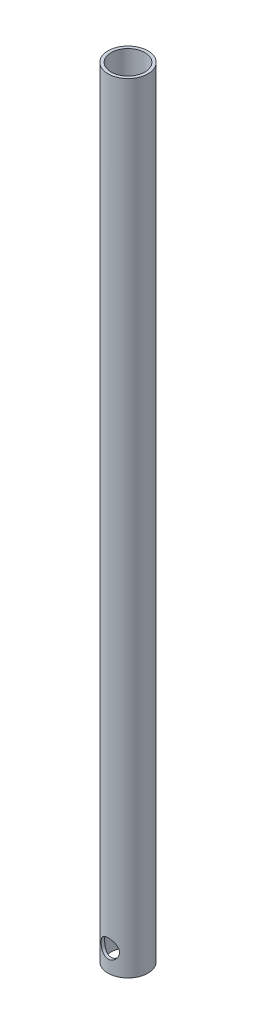
ISO-10303-21;
HEADER;
FILE_DESCRIPTION(('STEP AP214'),'2;1');
FILE_NAME('part.step','',(''),(''),'','','');
FILE_SCHEMA(('AUTOMOTIVE_DESIGN { 1 0 10303 214 1 1 1 1 }'));
ENDSEC;
DATA;
#1=APPLICATION_CONTEXT('core data for automotive mechanical design processes');
#2=APPLICATION_PROTOCOL_DEFINITION('international standard','automotive_design',2000,#1);
#3=PRODUCT_CONTEXT('',#1,'mechanical');
#4=PRODUCT('Part','Part','',(#3));
#5=PRODUCT_RELATED_PRODUCT_CATEGORY('part','',(#4));
#6=PRODUCT_DEFINITION_FORMATION('','',#4);
#7=PRODUCT_DEFINITION_CONTEXT('part definition',#1,'design');
#8=PRODUCT_DEFINITION('design','',#6,#7);
#9=PRODUCT_DEFINITION_SHAPE('','',#8);
#10=(LENGTH_UNIT() NAMED_UNIT(*) SI_UNIT(.MILLI.,.METRE.));
#11=(NAMED_UNIT(*) PLANE_ANGLE_UNIT() SI_UNIT($,.RADIAN.));
#12=(NAMED_UNIT(*) SI_UNIT($,.STERADIAN.) SOLID_ANGLE_UNIT());
#13=UNCERTAINTY_MEASURE_WITH_UNIT(LENGTH_MEASURE(1.E-05),#10,'distance_accuracy_value','');
#14=(GEOMETRIC_REPRESENTATION_CONTEXT(3) GLOBAL_UNCERTAINTY_ASSIGNED_CONTEXT((#13)) GLOBAL_UNIT_ASSIGNED_CONTEXT((#10,
#11,#12)) REPRESENTATION_CONTEXT('',''));
#15=CARTESIAN_POINT('',(0.,0.,0.));
#16=DIRECTION('',(0.,0.,1.));
#17=DIRECTION('',(1.,0.,0.));
#18=AXIS2_PLACEMENT_3D('',#15,#16,#17);
#19=CARTESIAN_POINT('',(0.,253.8,0.));
#20=DIRECTION('',(0.,1.,0.));
#21=DIRECTION('',(0.,0.,1.));
#22=AXIS2_PLACEMENT_3D('',#19,#20,#21);
#23=PLANE('',#22);
#24=CARTESIAN_POINT('',(0.,253.8,0.));
#25=DIRECTION('',(0.,1.,0.));
#26=DIRECTION('',(0.,0.,1.));
#27=AXIS2_PLACEMENT_3D('',#24,#25,#26);
#28=CIRCLE('',#27,6.5);
#29=CARTESIAN_POINT('',(0.,253.8,6.5));
#30=VERTEX_POINT('',#29);
#31=EDGE_CURVE('E10',#30,#30,#28,.T.);
#32=ORIENTED_EDGE('',*,*,#31,.T.);
#33=EDGE_LOOP('',(#32));
#34=FACE_BOUND('',#33,.T.);
#35=CARTESIAN_POINT('',(0.,253.8,0.));
#36=DIRECTION('',(0.,1.,0.));
#37=DIRECTION('',(0.,0.,1.));
#38=AXIS2_PLACEMENT_3D('',#35,#36,#37);
#39=CIRCLE('',#38,5.5);
#40=CARTESIAN_POINT('',(0.,253.8,5.5));
#41=VERTEX_POINT('',#40);
#42=EDGE_CURVE('E65',#41,#41,#39,.T.);
#43=ORIENTED_EDGE('',*,*,#42,.F.);
#44=EDGE_LOOP('',(#43));
#45=FACE_BOUND('',#44,.T.);
#46=ADVANCED_FACE('F44',(#34,#45),#23,.T.);
#47=CARTESIAN_POINT('',(0.,0.,0.));
#48=DIRECTION('',(0.,1.,0.));
#49=DIRECTION('',(0.,0.,1.));
#50=AXIS2_PLACEMENT_3D('',#47,#48,#49);
#51=PLANE('',#50);
#52=CARTESIAN_POINT('',(0.,0.,0.));
#53=DIRECTION('',(0.,1.,0.));
#54=DIRECTION('',(0.,0.,1.));
#55=AXIS2_PLACEMENT_3D('',#52,#53,#54);
#56=CIRCLE('',#55,6.5);
#57=CARTESIAN_POINT('',(0.,0.,6.5));
#58=VERTEX_POINT('',#57);
#59=EDGE_CURVE('E59',#58,#58,#56,.T.);
#60=ORIENTED_EDGE('',*,*,#59,.F.);
#61=EDGE_LOOP('',(#60));
#62=FACE_BOUND('',#61,.T.);
#63=CARTESIAN_POINT('',(0.,0.,0.));
#64=DIRECTION('',(0.,1.,0.));
#65=DIRECTION('',(0.,0.,1.));
#66=AXIS2_PLACEMENT_3D('',#63,#64,#65);
#67=CIRCLE('',#66,5.5);
#68=CARTESIAN_POINT('',(0.,0.,5.5));
#69=VERTEX_POINT('',#68);
#70=EDGE_CURVE('E68',#69,#69,#67,.T.);
#71=ORIENTED_EDGE('',*,*,#70,.T.);
#72=EDGE_LOOP('',(#71));
#73=FACE_BOUND('',#72,.T.);
#74=ADVANCED_FACE('F109',(#62,#73),#51,.F.);
#75=CARTESIAN_POINT('',(0.,253.8,0.));
#76=DIRECTION('',(0.,-1.,0.));
#77=DIRECTION('',(0.,0.,-1.));
#78=AXIS2_PLACEMENT_3D('',#75,#76,#77);
#79=CYLINDRICAL_SURFACE('',#78,6.5);
#80=CARTESIAN_POINT('',(0.,10.,-6.5));
#81=CARTESIAN_POINT('',(-0.159129740023639,9.99999017473008,-6.49999193598454));
#82=CARTESIAN_POINT('',(-0.318496713154491,9.9872633550092,-6.49409129449356));
#83=CARTESIAN_POINT('',(-0.632606247293037,9.93687401404484,-6.47106985631113));
#84=CARTESIAN_POINT('',(-0.787337527979162,9.89915513252581,-6.45392370044473));
#85=CARTESIAN_POINT('',(-1.08714223490985,9.80052257783211,-6.41022516067749));
#86=CARTESIAN_POINT('',(-1.23224885516992,9.7396940798648,-6.38370734269335));
#87=CARTESIAN_POINT('',(-1.5100230756993,9.59696635982486,-6.32376859265665));
#88=CARTESIAN_POINT('',(-1.64269292826374,9.51507096305906,-6.29034891405416));
#89=CARTESIAN_POINT('',(-1.89986895880032,9.32748258381068,-6.21766070429636));
#90=CARTESIAN_POINT('',(-2.0235516919668,9.22074617614938,-6.17817421262096));
#91=CARTESIAN_POINT('',(-2.25199750098769,8.98872874679698,-6.09862012204946));
#92=CARTESIAN_POINT('',(-2.35674840232589,8.86343588553361,-6.05855216699364));
#93=CARTESIAN_POINT('',(-2.55097774210912,8.58827811275502,-5.97948202000591));
#94=CARTESIAN_POINT('',(-2.6390656956309,8.43735860340822,-5.94070870234375));
#95=CARTESIAN_POINT('',(-2.7882438591157,8.12082650618631,-5.87217879105201));
#96=CARTESIAN_POINT('',(-2.84935096753515,7.95522319324721,-5.8424165573445));
#97=CARTESIAN_POINT('',(-2.93924908147225,7.62344905365085,-5.79769142785815));
#98=CARTESIAN_POINT('',(-2.96963584911131,7.4578127608086,-5.78200314681251));
#99=CARTESIAN_POINT('',(-3.00217547679102,7.12310854140559,-5.76518133384984));
#100=CARTESIAN_POINT('',(-3.00434957269561,6.95404329186308,-5.76403685473072));
#101=CARTESIAN_POINT('',(-2.98158560174146,6.63505136876397,-5.77583284667212));
#102=CARTESIAN_POINT('',(-2.95928670198316,6.48487442224178,-5.78740239735021));
#103=CARTESIAN_POINT('',(-2.8927121855557,6.19069776762691,-5.82096135525654));
#104=CARTESIAN_POINT('',(-2.84843109629297,6.04669960748253,-5.84295335715261));
#105=CARTESIAN_POINT('',(-2.73827780955064,5.76499143178999,-5.89538912754499));
#106=CARTESIAN_POINT('',(-2.67193346170893,5.62750154525278,-5.92601526462824));
#107=CARTESIAN_POINT('',(-2.51988161713396,5.3649984621007,-5.99225038850181));
#108=CARTESIAN_POINT('',(-2.4341657205687,5.23999071195688,-6.02786153431938));
#109=CARTESIAN_POINT('',(-2.23518179489322,4.99205918617678,-6.10462808948972));
#110=CARTESIAN_POINT('',(-2.11995698607915,4.87075894268322,-6.14597120104821));
#111=CARTESIAN_POINT('',(-1.8705012656823,4.64858899027007,-6.2264272302949));
#112=CARTESIAN_POINT('',(-1.73626371927504,4.54772644343186,-6.26553936273227));
#113=CARTESIAN_POINT('',(-1.44669684750736,4.36613618738704,-6.33877675561601));
#114=CARTESIAN_POINT('',(-1.29080393285876,4.28621338448353,-6.37268619348079));
#115=CARTESIAN_POINT('',(-0.965818596709175,4.15432127890139,-6.42995630206117));
#116=CARTESIAN_POINT('',(-0.796735240219265,4.10233296896144,-6.45332414377606));
#117=CARTESIAN_POINT('',(-0.463602839452803,4.03151684634582,-6.48544360814954));
#118=CARTESIAN_POINT('',(-0.300107360641255,4.01051958486213,-6.49514898263157));
#119=CARTESIAN_POINT('',(0.028350915845919,3.99563787013211,-6.50201026325202));
#120=CARTESIAN_POINT('',(0.19331313792917,4.00174321238445,-6.49917089266059));
#121=CARTESIAN_POINT('',(0.508895457702859,4.03948101723621,-6.48185390166459));
#122=CARTESIAN_POINT('',(0.659759631845761,4.06946203263594,-6.46812943096816));
#123=CARTESIAN_POINT('',(0.954079363496144,4.15165194153627,-6.43130946000994));
#124=CARTESIAN_POINT('',(1.09753404370171,4.20386346044778,-6.40821285291883));
#125=CARTESIAN_POINT('',(1.37801009985268,4.33063531255866,-6.35390691630445));
#126=CARTESIAN_POINT('',(1.51469681576858,4.40583499464223,-6.32246943811059));
#127=CARTESIAN_POINT('',(1.77399872636956,4.57575074864869,-6.25467179735359));
#128=CARTESIAN_POINT('',(1.89660770091261,4.6704753962535,-6.2183094741333));
#129=CARTESIAN_POINT('',(2.13543211180621,4.88623403715673,-6.14060481803729));
#130=CARTESIAN_POINT('',(2.25018643549152,5.00883166984395,-6.09910334732874));
#131=CARTESIAN_POINT('',(2.45803592830905,5.27194231065562,-6.01834862228961));
#132=CARTESIAN_POINT('',(2.55112140483568,5.41246329266641,-5.97909637994756));
#133=CARTESIAN_POINT('',(2.71549078439324,5.71302444504298,-5.90630663365424));
#134=CARTESIAN_POINT('',(2.7860302646306,5.87352638341619,-5.87297784394502));
#135=CARTESIAN_POINT('',(2.89837428577096,6.2061754464772,-5.81836702125635));
#136=CARTESIAN_POINT('',(2.94020977297888,6.37830980931597,-5.79707201881292));
#137=CARTESIAN_POINT('',(2.99058122218971,6.71286433748518,-5.77123490611808));
#138=CARTESIAN_POINT('',(3.00174910461875,6.87478588018007,-5.76537064588626));
#139=CARTESIAN_POINT('',(2.99780698335844,7.19819876018098,-5.76742289005739));
#140=CARTESIAN_POINT('',(2.98270389873474,7.35969019954603,-5.77533576593401));
#141=CARTESIAN_POINT('',(2.92900530543887,7.66589017025347,-5.80273428313344));
#142=CARTESIAN_POINT('',(2.89212339406143,7.8109833010644,-5.82137347311721));
#143=CARTESIAN_POINT('',(2.79781129073869,8.09286629665376,-5.86728099507624));
#144=CARTESIAN_POINT('',(2.74037502634773,8.22965369365606,-5.89455187686754));
#145=CARTESIAN_POINT('',(2.60228329976768,8.50093182610409,-5.95686250351635));
#146=CARTESIAN_POINT('',(2.52034815272259,8.63467850089649,-5.99229551057882));
#147=CARTESIAN_POINT('',(2.337161167601,8.88733842358027,-6.06608759795383));
#148=CARTESIAN_POINT('',(2.2359005149025,9.00624486154883,-6.10444800868419));
#149=CARTESIAN_POINT('',(2.00534865465994,9.23781409154042,-6.18424324123373));
#150=CARTESIAN_POINT('',(1.87428881140545,9.348743913788,-6.22561407277446));
#151=CARTESIAN_POINT('',(1.59393984404993,9.54731469902411,-6.30320829595265));
#152=CARTESIAN_POINT('',(1.44464220373,9.63494472093288,-6.33942926562567));
#153=CARTESIAN_POINT('',(1.21054873877767,9.74627150458626,-6.38677604060827));
#154=CARTESIAN_POINT('',(1.13106523731987,9.77996029023894,-6.40136272006654));
#155=CARTESIAN_POINT('',(0.969110715863016,9.84047216452385,-6.42787190184105));
#156=CARTESIAN_POINT('',(0.886641165315949,9.86729857912802,-6.43979569441628));
#157=CARTESIAN_POINT('',(0.719534074866295,9.91372218892631,-6.46059969153181));
#158=CARTESIAN_POINT('',(0.634902095723692,9.93333625394734,-6.46948699498256));
#159=CARTESIAN_POINT('',(0.464024245926371,9.96516871803236,-6.48398207342718));
#160=CARTESIAN_POINT('',(0.377779496367203,9.97739207105389,-6.48959204511479));
#161=CARTESIAN_POINT('',(0.242771973816678,9.990555421124,-6.49564511866125));
#162=CARTESIAN_POINT('',(0.194301346625717,9.9940947815264,-6.49727604396627));
#163=CARTESIAN_POINT('',(0.0972278648476504,9.99881859337198,-6.49945472646916));
#164=CARTESIAN_POINT('',(0.0486250078887121,10.0000030022913,-6.50000246410769));
#165=CARTESIAN_POINT('',(0.,10.,-6.5));
#166=B_SPLINE_CURVE_WITH_KNOTS('',3,(#80,#81,#82,#83,#84,#85,#86,#87,#88,#89,#90,#91,#92,#93,
#94,#95,#96,#97,#98,#99,#100,#101,#102,#103,#104,#105,#106,#107,#108,#109,#110,#111,#112,#113,
#114,#115,#116,#117,#118,#119,#120,#121,#122,#123,#124,#125,#126,#127,#128,#129,#130,#131,#132,
#133,#134,#135,#136,#137,#138,#139,#140,#141,#142,#143,#144,#145,#146,#147,#148,#149,#150,#151,
#152,#153,#154,#155,#156,#157,#158,#159,#160,#161,#162,#163,#164,#165),.UNSPECIFIED.,.T.,.F.,(4,
2,2,2,2,2,2,2,2,2,2,2,2,2,2,2,2,2,2,2,2,2,2,2,2,2,2,2,2,2,2,2,2,2,2,2,2,2,2,2,2,2,4),(0.,
0.477200204967823,0.955480236490606,1.43201430730961,1.90846191054199,2.41054736697623,
2.91295456010355,3.44723474488289,3.98117982667257,4.4856906195183,4.98982164171928,
5.44449010747481,5.89927182239017,6.36448978686468,6.82990986610931,7.34463261353582,
7.85953542698887,8.39201594880152,8.92413369853157,9.41686930204894,9.90941939960484,
10.3705828952427,10.8318008691632,11.3072372627792,11.7828829224499,12.2995111125967,
12.8163699514819,13.3488589877167,13.8807730317792,14.3653541002028,14.8498075623387,
15.3004415694755,15.7512088190771,16.2316520984591,16.7123150404513,17.2397422544707,
17.767416701186,18.0297750672698,18.2920060346837,18.553619677245,18.815057766518,
18.960872400173,19.106689666811),.UNSPECIFIED.);
#167=CARTESIAN_POINT('',(0.,10.,-6.5));
#168=VERTEX_POINT('',#167);
#169=EDGE_CURVE('E95',#168,#168,#166,.T.);
#170=ORIENTED_EDGE('',*,*,#169,.T.);
#171=EDGE_LOOP('',(#170));
#172=FACE_BOUND('',#171,.T.);
#173=CARTESIAN_POINT('',(3.,7.,5.7662812973354));
#174=CARTESIAN_POINT('',(2.99999892719103,6.92090366155287,5.7662824041858));
#175=CARTESIAN_POINT('',(2.99686530497004,6.84178674017377,5.76791624419875));
#176=CARTESIAN_POINT('',(2.98437853755329,6.68416461952166,5.77438517659444));
#177=CARTESIAN_POINT('',(2.97502192557185,6.60565978591604,5.77922205336089));
#178=CARTESIAN_POINT('',(2.93770899505838,6.37169448794232,5.79833697637531));
#179=CARTESIAN_POINT('',(2.90050989244509,6.21796771532167,5.81721875496855));
#180=CARTESIAN_POINT('',(2.80339356109917,5.92045089272227,5.86462553439727));
#181=CARTESIAN_POINT('',(2.74358329917195,5.77661776805383,5.89310506324811));
#182=CARTESIAN_POINT('',(2.6032647229774,5.50102732700496,5.95641881874676));
#183=CARTESIAN_POINT('',(2.5227580892682,5.36926903131877,5.99125252936442));
#184=CARTESIAN_POINT('',(2.33673234795277,5.11143158022353,6.0663341046164));
#185=CARTESIAN_POINT('',(2.22986048570008,4.98638921577493,6.10679013043282));
#186=CARTESIAN_POINT('',(1.99696456553064,4.75521319899818,6.18686473639462));
#187=CARTESIAN_POINT('',(1.87093212364578,4.64908786845041,6.22648294125347));
#188=CARTESIAN_POINT('',(1.59474452628358,4.45303847640488,6.30304782916318));
#189=CARTESIAN_POINT('',(1.44364010184939,4.36433681247648,6.33972513458496));
#190=CARTESIAN_POINT('',(1.12664818214727,4.21407502665284,6.40365032914537));
#191=CARTESIAN_POINT('',(0.960768727879769,4.15250024871219,6.43090330831924));
#192=CARTESIAN_POINT('',(0.629867296152075,4.06217364519372,6.47142172253039));
#193=CARTESIAN_POINT('',(0.465432865267238,4.0316195743694,6.48545127395434));
#194=CARTESIAN_POINT('',(0.133215396001771,3.9983200998117,6.50075757663594));
#195=CARTESIAN_POINT('',(-0.034565906530281,3.99556063783623,6.50204077487018));
#196=CARTESIAN_POINT('',(-0.355383248423285,4.01711197864334,6.49211503600964));
#197=CARTESIAN_POINT('',(-0.508587936316257,4.03942489183644,6.48182801238951));
#198=CARTESIAN_POINT('',(-0.808790813996176,4.10698533527033,6.45125024575794));
#199=CARTESIAN_POINT('',(-0.955788542296879,4.15223456758079,6.43095876033352));
#200=CARTESIAN_POINT('',(-1.24211306024069,4.26482407447642,6.38189548383631));
#201=CARTESIAN_POINT('',(-1.38129150352778,4.33248589014146,6.35300091840888));
#202=CARTESIAN_POINT('',(-1.64668011312756,4.48761180335084,6.28944298734345));
#203=CARTESIAN_POINT('',(-1.77288549876412,4.57508316310728,6.25477750731624));
#204=CARTESIAN_POINT('',(-2.01997730258401,4.77579277501274,6.17962232143338));
#205=CARTESIAN_POINT('',(-2.13953795464621,4.8905734072825,6.13888798700221));
#206=CARTESIAN_POINT('',(-2.35836493454558,5.1384229890058,6.05819648646963));
#207=CARTESIAN_POINT('',(-2.45761958963877,5.27150238428132,6.01823977925512));
#208=CARTESIAN_POINT('',(-2.63758131247766,5.56006125569927,5.94164944704398));
#209=CARTESIAN_POINT('',(-2.71717567801316,5.716307164923,5.90526579358042));
#210=CARTESIAN_POINT('',(-2.84836197191196,6.04208832520564,5.84312944168726));
#211=CARTESIAN_POINT('',(-2.89997904370536,6.21161148651722,5.81736720270413));
#212=CARTESIAN_POINT('',(-2.96996596551545,6.54584369064573,5.78193242353794));
#213=CARTESIAN_POINT('',(-2.99051034007505,6.70998313244996,5.7712118129628));
#214=CARTESIAN_POINT('',(-3.00426497674304,7.03967922785382,5.76406750219063));
#215=CARTESIAN_POINT('',(-2.99748894589613,7.20523512919969,5.76763663261645));
#216=CARTESIAN_POINT('',(-2.95878815711195,7.51792263700058,5.78756896444843));
#217=CARTESIAN_POINT('',(-2.92908348982966,7.6654115248981,5.80280181766003));
#218=CARTESIAN_POINT('',(-2.84849190900649,7.95311327171041,5.84278200299037));
#219=CARTESIAN_POINT('',(-2.7975992111938,8.09332413197983,5.86753193310289));
#220=CARTESIAN_POINT('',(-2.67355088060951,8.36971537294369,5.92511509399259));
#221=CARTESIAN_POINT('',(-2.59948312083704,8.50541777483052,5.95826637205948));
#222=CARTESIAN_POINT('',(-2.43203033220662,8.76320156576096,6.02855440600752));
#223=CARTESIAN_POINT('',(-2.33863585441184,8.88527624702659,6.06569310707171));
#224=CARTESIAN_POINT('',(-2.12378251426491,9.12559323925577,6.14442341777977));
#225=CARTESIAN_POINT('',(-2.00041509249073,9.24211656272064,6.18607643086922));
#226=CARTESIAN_POINT('',(-1.7350444001298,9.45323671243834,6.26568418275316));
#227=CARTESIAN_POINT('',(-1.59303754322331,9.54782930939693,6.3036382073889));
#228=CARTESIAN_POINT('',(-1.2915592225264,9.71326429672461,6.37228797907225));
#229=CARTESIAN_POINT('',(-1.13188273885085,9.78377817427351,6.40288176688196));
#230=CARTESIAN_POINT('',(-0.801128105016182,9.89631594101559,6.45260224604821));
#231=CARTESIAN_POINT('',(-0.630058548485856,9.93836104235955,6.4717374739723));
#232=CARTESIAN_POINT('',(-0.296548326358992,9.98967453632871,6.49520510230621));
#233=CARTESIAN_POINT('',(-0.134553127003681,10.0013515842112,6.50062432624297));
#234=CARTESIAN_POINT('',(0.189124541797987,9.99840024150235,6.49926113378109));
#235=CARTESIAN_POINT('',(0.350807080474667,9.98377856008833,6.49248182939916));
#236=CARTESIAN_POINT('',(0.660754207452236,9.93034075462643,6.46810472426798));
#237=CARTESIAN_POINT('',(0.809284171711096,9.89278285246298,6.45107014930805));
#238=CARTESIAN_POINT('',(1.09778411310708,9.79607384824403,6.4082879436905));
#239=CARTESIAN_POINT('',(1.23775266863206,9.73691917137185,6.38253887061287));
#240=CARTESIAN_POINT('',(1.51224129438351,9.59577070508666,6.32326977695387));
#241=CARTESIAN_POINT('',(1.64622279774786,9.51285934634897,6.28944921954487));
#242=CARTESIAN_POINT('',(1.89896175393015,9.32776731863006,6.21781533039487));
#243=CARTESIAN_POINT('',(2.01771239383843,9.22557807661759,6.18000022555124));
#244=CARTESIAN_POINT('',(2.24722865103565,8.99466572955266,6.1004874246305));
#245=CARTESIAN_POINT('',(2.3564474096765,8.86442227818796,6.05873384395763));
#246=CARTESIAN_POINT('',(2.55192090953216,8.5863631953114,5.97903673421762));
#247=CARTESIAN_POINT('',(2.63815988553219,8.43853560030023,5.94109583188614));
#248=CARTESIAN_POINT('',(2.74851943476843,8.20547550495888,5.89044161581813));
#249=CARTESIAN_POINT('',(2.78228527023622,8.1253811443177,5.87452259641375));
#250=CARTESIAN_POINT('',(2.84286187256677,7.96213403751631,5.84544837720605));
#251=CARTESIAN_POINT('',(2.86967616401837,7.87898286574337,5.83229177743979));
#252=CARTESIAN_POINT('',(2.91596756922036,7.71045937143798,5.8092857183573));
#253=CARTESIAN_POINT('',(2.93546386399615,7.62509349144627,5.79942762089389));
#254=CARTESIAN_POINT('',(2.96694088491338,7.452690435396,5.7833880204601));
#255=CARTESIAN_POINT('',(2.97892713920621,7.36565453739483,5.77720381330811));
#256=CARTESIAN_POINT('',(2.99137690295278,7.23199203843927,5.77076114407696));
#257=CARTESIAN_POINT('',(2.99460875250522,7.18567258660675,5.76908349384968));
#258=CARTESIAN_POINT('',(2.99892066087503,7.09290446013478,5.7668432222206));
#259=CARTESIAN_POINT('',(3.00000063009462,7.0464557801953,5.76628064724717));
#260=CARTESIAN_POINT('',(3.,7.,5.7662812973354));
#261=B_SPLINE_CURVE_WITH_KNOTS('',3,(#173,#174,#175,#176,#177,#178,#179,#180,#181,#182,#183,
#184,#185,#186,#187,#188,#189,#190,#191,#192,#193,#194,#195,#196,#197,#198,#199,#200,#201,#202,
#203,#204,#205,#206,#207,#208,#209,#210,#211,#212,#213,#214,#215,#216,#217,#218,#219,#220,#221,
#222,#223,#224,#225,#226,#227,#228,#229,#230,#231,#232,#233,#234,#235,#236,#237,#238,#239,#240,
#241,#242,#243,#244,#245,#246,#247,#248,#249,#250,#251,#252,#253,#254,#255,#256,#257,#258,#259,
#260),.UNSPECIFIED.,.T.,.F.,(4,2,2,2,2,2,2,2,2,2,2,2,2,2,2,2,2,2,2,2,2,2,2,2,2,2,2,2,2,2,2,2,2,
2,2,2,2,2,2,2,2,2,2,4),(0.,0.237237717397183,0.474607709155717,0.949893494085578,
1.42295841921351,1.89598494330493,2.40199835440689,2.90823381912452,3.4424990045217,
3.97647518341919,4.47726179635917,4.97779510358745,5.44110494472953,5.90444917243123,
6.3747515312605,6.84522658362607,7.35501653840184,7.8650987236102,8.39955094728877,
8.93352205446184,9.42804423267751,9.92231833280604,10.3739499175172,10.8257048772922,
11.2981306882405,11.7707880187338,12.2926027019784,12.8145179325318,13.343293173903,
13.8716739887806,14.356652503762,14.8415073114211,15.3018936933558,15.762356315547,
16.2437925357334,16.7254433613849,17.2482079154009,17.7713301925456,18.036124984217,
18.3007852552469,18.5647469055083,18.8285140242453,18.9678454347103,19.1071826463918),.UNSPECIFIED.);
#262=CARTESIAN_POINT('',(3.,7.,5.7662812973354));
#263=VERTEX_POINT('',#262);
#264=EDGE_CURVE('E89',#263,#263,#261,.T.);
#265=ORIENTED_EDGE('',*,*,#264,.T.);
#266=EDGE_LOOP('',(#265));
#267=FACE_BOUND('',#266,.T.);
#268=ORIENTED_EDGE('',*,*,#31,.F.);
#269=EDGE_LOOP('',(#268));
#270=FACE_BOUND('',#269,.T.);
#271=ORIENTED_EDGE('',*,*,#59,.T.);
#272=EDGE_LOOP('',(#271));
#273=FACE_BOUND('',#272,.T.);
#274=ADVANCED_FACE('F46',(#172,#267,#270,#273),#79,.T.);
#275=CARTESIAN_POINT('',(0.,253.8,0.));
#276=DIRECTION('',(0.,-1.,0.));
#277=DIRECTION('',(0.,0.,-1.));
#278=AXIS2_PLACEMENT_3D('',#275,#276,#277);
#279=CYLINDRICAL_SURFACE('',#278,5.5);
#280=CARTESIAN_POINT('',(0.,10.,-5.5));
#281=CARTESIAN_POINT('',(-0.155941063421444,9.99998776625485,-5.49998934645942));
#282=CARTESIAN_POINT('',(-0.312022244637957,9.98776941250185,-5.49329922861326));
#283=CARTESIAN_POINT('',(-0.619456123460684,9.93948528535259,-5.46719110321039));
#284=CARTESIAN_POINT('',(-0.770801809879891,9.90338575606145,-5.44775507973285));
#285=CARTESIAN_POINT('',(-1.06387890229515,9.80922722387482,-5.39816336864634));
#286=CARTESIAN_POINT('',(-1.2056469629153,9.75125827773093,-5.36805167294482));
#287=CARTESIAN_POINT('',(-1.47716738440041,9.61553845586301,-5.29977412152277));
#288=CARTESIAN_POINT('',(-1.60691935336558,9.53778693524832,-5.26160800324365));
#289=CARTESIAN_POINT('',(-1.86065808630957,9.35874354244755,-5.17754827162183));
#290=CARTESIAN_POINT('',(-1.98365138350542,9.2562096415092,-5.13130551076905));
#291=CARTESIAN_POINT('',(-2.21162440384053,9.03327298036498,-5.03725688162035));
#292=CARTESIAN_POINT('',(-2.3165875795777,8.9128539928279,-4.98944962487666));
#293=CARTESIAN_POINT('',(-2.51580320599146,8.64358031353826,-4.89225579731101));
#294=CARTESIAN_POINT('',(-2.60804479874463,8.49310297662991,-4.84316197373408));
#295=CARTESIAN_POINT('',(-2.72612131067995,8.25543295128291,-4.77706066879849));
#296=CARTESIAN_POINT('',(-2.76210762605457,8.17418871122853,-4.75627790322473));
#297=CARTESIAN_POINT('',(-2.82693033455558,8.00816201497697,-4.71803762242415));
#298=CARTESIAN_POINT('',(-2.85577130922819,7.92338186694301,-4.70057797810682));
#299=CARTESIAN_POINT('',(-2.90433120982499,7.75627586505315,-4.67071979929958));
#300=CARTESIAN_POINT('',(-2.92450709956388,7.67412704714305,-4.65807341027243));
#301=CARTESIAN_POINT('',(-2.95790013004684,7.50794113595042,-4.636940586029));
#302=CARTESIAN_POINT('',(-2.971121334648,7.42390517539192,-4.62845172163124));
#303=CARTESIAN_POINT('',(-2.99037426310065,7.2547480886835,-4.61603691921718));
#304=CARTESIAN_POINT('',(-2.99641259468195,7.16962803280957,-4.61210678757553));
#305=CARTESIAN_POINT('',(-3.00121376340649,6.99912642085636,-4.60898198112864));
#306=CARTESIAN_POINT('',(-2.99997756333254,6.91374490087672,-4.60978667966958));
#307=CARTESIAN_POINT('',(-2.98681097313761,6.6839186459394,-4.61834579083673));
#308=CARTESIAN_POINT('',(-2.96800123578851,6.53996088678797,-4.63057015028549));
#309=CARTESIAN_POINT('',(-2.91031570386976,6.25779537186718,-4.66703114872268));
#310=CARTESIAN_POINT('',(-2.87143107833692,6.11959017559325,-4.69127307406343));
#311=CARTESIAN_POINT('',(-2.7741819673555,5.84889239883274,-4.74943950696628));
#312=CARTESIAN_POINT('',(-2.71541055604209,5.71659052565581,-4.78356393514266));
#313=CARTESIAN_POINT('',(-2.58039836306707,5.46305348310249,-4.85772269523237));
#314=CARTESIAN_POINT('',(-2.50414997528337,5.34182316437556,-4.89775959759585));
#315=CARTESIAN_POINT('',(-2.32264342212813,5.0941131405792,-4.9866863072689));
#316=CARTESIAN_POINT('',(-2.21472183175866,4.96972500912414,-5.03598723363806));
#317=CARTESIAN_POINT('',(-1.979587611086,4.73984746934874,-5.13297379201875));
#318=CARTESIAN_POINT('',(-1.85236228439249,4.6343705996332,-5.18065833546759));
#319=CARTESIAN_POINT('',(-1.57192373832685,4.43872598082471,-5.27277876450855));
#320=CARTESIAN_POINT('',(-1.41755927747899,4.34999760004203,-5.31680246425557));
#321=CARTESIAN_POINT('',(-1.09311155895661,4.20054994222199,-5.39284422102395));
#322=CARTESIAN_POINT('',(-0.923043054476388,4.13980469136586,-5.42487340611344));
#323=CARTESIAN_POINT('',(-0.588793718376775,4.05376550133339,-5.47075015884768));
#324=CARTESIAN_POINT('',(-0.425517581227579,4.02571761228154,-5.48600266963769));
#325=CARTESIAN_POINT('',(-0.0959037074405207,3.99698200241574,-5.50163219493907));
#326=CARTESIAN_POINT('',(0.0704320609196729,3.99627726778399,-5.5020184597207));
#327=CARTESIAN_POINT('',(0.384407887416388,4.02096725150693,-5.48858467704625));
#328=CARTESIAN_POINT('',(0.53231256443774,4.04386838532566,-5.47612189948116));
#329=CARTESIAN_POINT('',(0.821803448329099,4.11093103425571,-5.44021310025175));
#330=CARTESIAN_POINT('',(0.963389009570952,4.1550947163665,-5.4167659591087));
#331=CARTESIAN_POINT('',(1.24014411300805,4.26418363790883,-5.36026763933604));
#332=CARTESIAN_POINT('',(1.37508882708081,4.32956644253297,-5.32700641844797));
#333=CARTESIAN_POINT('',(1.63245398018259,4.4786432802591,-5.25385773737809));
#334=CARTESIAN_POINT('',(1.75486972773108,4.56234413601794,-5.21396780963469));
#335=CARTESIAN_POINT('',(1.99815282198784,4.75630060737516,-5.12600339488922));
#336=CARTESIAN_POINT('',(2.11734529259495,4.86847105328152,-5.07751178350356));
#337=CARTESIAN_POINT('',(2.33610542561796,5.11073588875991,-4.98065786860873));
#338=CARTESIAN_POINT('',(2.43565323999881,5.24084818280163,-4.93229574408554));
#339=CARTESIAN_POINT('',(2.61963250753659,5.52739933693934,-4.83725612466919));
#340=CARTESIAN_POINT('',(2.70237599151256,5.6850795072938,-4.79097531469677));
#341=CARTESIAN_POINT('',(2.80508264493022,5.93252130095532,-4.73107633674494));
#342=CARTESIAN_POINT('',(2.83575119684129,6.01682708473847,-4.71269630244518));
#343=CARTESIAN_POINT('',(2.88956639673594,6.18853131435695,-4.67989324762477));
#344=CARTESIAN_POINT('',(2.91271827500878,6.27592756261107,-4.66546747672198));
#345=CARTESIAN_POINT('',(2.94925497294053,6.44448426685662,-4.64244713409255));
#346=CARTESIAN_POINT('',(2.96336861092828,6.52542880522847,-4.63342309946558));
#347=CARTESIAN_POINT('',(2.98491873324379,6.68851924014054,-4.61956980430958));
#348=CARTESIAN_POINT('',(2.99235896403633,6.77066443626938,-4.61473819019659));
#349=CARTESIAN_POINT('',(3.00043681599167,6.93539893260763,-4.60949070639388));
#350=CARTESIAN_POINT('',(3.00107744502081,7.01798802027969,-4.60907288422311));
#351=CARTESIAN_POINT('',(2.99556143120456,7.1828158305591,-4.6126580918879));
#352=CARTESIAN_POINT('',(2.98940531592175,7.26505457986232,-4.61666077860403));
#353=CARTESIAN_POINT('',(2.96339264598749,7.48846986932802,-4.63343681741845));
#354=CARTESIAN_POINT('',(2.93679716733749,7.62860747260118,-4.65049102224356));
#355=CARTESIAN_POINT('',(2.86467928059993,7.90203653358025,-4.69524977180096));
#356=CARTESIAN_POINT('',(2.81914932754625,8.03532523833736,-4.72295856181586));
#357=CARTESIAN_POINT('',(2.70741690494186,8.30072716222971,-4.78793410722282));
#358=CARTESIAN_POINT('',(2.64010400762598,8.43225071121332,-4.82568847064194));
#359=CARTESIAN_POINT('',(2.48777352181176,8.68301365475126,-4.90595435235985));
#360=CARTESIAN_POINT('',(2.4027464783987,8.80224643810745,-4.94846840551116));
#361=CARTESIAN_POINT('',(2.20222061562176,9.04415207952497,-5.04125256725259));
#362=CARTESIAN_POINT('',(2.08404782523581,9.1645437340499,-5.09171152558289));
#363=CARTESIAN_POINT('',(1.82816340070133,9.38458841033915,-5.18907654030366));
#364=CARTESIAN_POINT('',(1.69043824590898,9.48422696251377,-5.23598010338573));
#365=CARTESIAN_POINT('',(1.46905733234175,9.61717831465468,-5.30076189758551));
#366=CARTESIAN_POINT('',(1.39145055424038,9.65926870340443,-5.3217101130451));
#367=CARTESIAN_POINT('',(1.23226646886365,9.7366657840448,-5.36080405718826));
#368=CARTESIAN_POINT('',(1.15069113181444,9.77197579989362,-5.37895115820844));
#369=CARTESIAN_POINT('',(0.984293707953536,9.83532656047251,-5.41187085663624));
#370=CARTESIAN_POINT('',(0.899478289502248,9.8633814000333,-5.42664999034571));
#371=CARTESIAN_POINT('',(0.727186421620291,9.91190750356937,-5.45241071911954));
#372=CARTESIAN_POINT('',(0.639711415020909,9.93238280273675,-5.46339433463232));
#373=CARTESIAN_POINT('',(0.460742252695537,9.9658377780891,-5.4814220540886));
#374=CARTESIAN_POINT('',(0.369201999270181,9.97862696784437,-5.48836591659683));
#375=CARTESIAN_POINT('',(0.185124291419888,9.99571168705078,-5.49765803948959));
#376=CARTESIAN_POINT('',(0.0925868425200882,10.000007263538,-5.50000632532357));
#377=CARTESIAN_POINT('',(0.,10.,-5.5));
#378=B_SPLINE_CURVE_WITH_KNOTS('',3,(#280,#281,#282,#283,#284,#285,#286,#287,#288,#289,#290,
#291,#292,#293,#294,#295,#296,#297,#298,#299,#300,#301,#302,#303,#304,#305,#306,#307,#308,#309,
#310,#311,#312,#313,#314,#315,#316,#317,#318,#319,#320,#321,#322,#323,#324,#325,#326,#327,#328,
#329,#330,#331,#332,#333,#334,#335,#336,#337,#338,#339,#340,#341,#342,#343,#344,#345,#346,#347,
#348,#349,#350,#351,#352,#353,#354,#355,#356,#357,#358,#359,#360,#361,#362,#363,#364,#365,#366,
#367,#368,#369,#370,#371,#372,#373,#374,#375,#376,#377),.UNSPECIFIED.,.T.,.F.,(4,2,2,2,2,2,2,2,
2,2,2,2,2,2,2,2,2,2,2,2,2,2,2,2,2,2,2,2,2,2,2,2,2,2,2,2,2,2,2,2,2,2,2,2,2,2,2,2,4),(0.,
0.467464731341324,0.935591637089737,1.40181150541894,1.86804657396242,2.36601468756277,
2.86443740470113,3.41095517185004,3.68439317893577,3.95765540292371,4.21386369857626,
4.46992211630614,4.72574479597636,4.9815336183278,5.41635042414011,5.85135866948457,
6.29586830542887,6.74057176413252,7.25410335547648,7.76797418110978,8.31522244881979,
8.86196173449555,9.35825276824622,9.85423498829536,10.3027073697705,10.7512254675536,
11.2101412211659,11.6692281922007,12.1791893511332,12.6896631420853,13.2383253286891,
13.5126865564027,13.7868564655196,14.0344708636162,14.2819461633036,14.5293119854526,
14.7766586084424,15.2055282482924,15.6345689471345,16.0903172872744,16.5463095089045,
17.0722946439693,17.5986452905915,17.8705372435758,18.1422955641225,18.4135218974199,
18.6846036269962,18.9621528638644,19.2397005637119),.UNSPECIFIED.);
#379=CARTESIAN_POINT('',(0.,10.,-5.5));
#380=VERTEX_POINT('',#379);
#381=EDGE_CURVE('E49',#380,#380,#378,.T.);
#382=ORIENTED_EDGE('',*,*,#381,.F.);
#383=EDGE_LOOP('',(#382));
#384=FACE_BOUND('',#383,.T.);
#385=CARTESIAN_POINT('',(3.,7.,4.60977222864644));
#386=CARTESIAN_POINT('',(3.00000008597304,6.92296588231687,4.60977195929469));
#387=CARTESIAN_POINT('',(2.99702726077329,6.84593719245015,4.6117116627994));
#388=CARTESIAN_POINT('',(2.98519422802146,6.69251533828672,4.61937852520386));
#389=CARTESIAN_POINT('',(2.97633201395444,6.61612239957506,4.62510697492637));
#390=CARTESIAN_POINT('',(2.94104477558707,6.38864547669194,4.64769754092072));
#391=CARTESIAN_POINT('',(2.9059193301432,6.23934353656087,4.66996453658734));
#392=CARTESIAN_POINT('',(2.81459785622989,5.95077165339767,4.72554949780908));
#393=CARTESIAN_POINT('',(2.75853128527708,5.81144621590334,4.75879942405126));
#394=CARTESIAN_POINT('',(2.62731895993887,5.54419807106102,4.83247875634438));
#395=CARTESIAN_POINT('',(2.55216945677507,5.4162776108617,4.87290957258763));
#396=CARTESIAN_POINT('',(2.37619973997968,5.16153116606892,4.96127876026238));
#397=CARTESIAN_POINT('',(2.27357166765848,5.03607464951933,5.00956397551092));
#398=CARTESIAN_POINT('',(2.04929435403232,4.80305652639237,5.10541646857248));
#399=CARTESIAN_POINT('',(1.9276339996559,4.69550545113527,5.152983309015));
#400=CARTESIAN_POINT('',(1.65629104155802,4.49246128747692,5.24680563819151));
#401=CARTESIAN_POINT('',(1.50511271613542,4.39874109622476,5.29261498791072));
#402=CARTESIAN_POINT('',(1.18616326116421,4.23870039921353,5.37307925730687));
#403=CARTESIAN_POINT('',(1.01840468525789,4.17235935751014,5.40774253285751));
#404=CARTESIAN_POINT('',(0.685630580744947,4.07468624430814,5.45947747434352));
#405=CARTESIAN_POINT('',(0.521519911154496,4.04092778139375,5.47775943157871));
#406=CARTESIAN_POINT('',(0.189034951864599,4.00129479197838,5.49926711916836));
#407=CARTESIAN_POINT('',(0.0206639234655223,3.99539954885252,5.5025040356542));
#408=CARTESIAN_POINT('',(-0.296926550240074,4.01093981656268,5.49403914581145));
#409=CARTESIAN_POINT('',(-0.446331843591326,4.02962193381151,5.48384216213375));
#410=CARTESIAN_POINT('',(-0.739495979653055,4.0887275857243,5.45205342878098));
#411=CARTESIAN_POINT('',(-0.883254389149231,4.12915278497925,5.43046080668933));
#412=CARTESIAN_POINT('',(-1.16318015948857,4.2306248139972,5.37750424944204));
#413=CARTESIAN_POINT('',(-1.29924531555408,4.29189598670848,5.34603431356582));
#414=CARTESIAN_POINT('',(-1.55943450999532,4.43288366988512,5.27601584980799));
#415=CARTESIAN_POINT('',(-1.68355465611017,4.51260616406279,5.23746502645309));
#416=CARTESIAN_POINT('',(-1.93049616504496,4.69793874412901,5.15189541994304));
#417=CARTESIAN_POINT('',(-2.05176580851316,4.80540341858745,5.10441200197027));
#418=CARTESIAN_POINT('',(-2.27546332034603,5.03826548525163,5.00870265938041));
#419=CARTESIAN_POINT('',(-2.37787202219613,5.16368089158588,4.96047603284213));
#420=CARTESIAN_POINT('',(-2.56971030186842,5.44196964573216,4.86405992638416));
#421=CARTESIAN_POINT('',(-2.65728391223288,5.59627335924457,4.81622552448167));
#422=CARTESIAN_POINT('',(-2.76775917452606,5.83920452489821,4.75303224258289));
#423=CARTESIAN_POINT('',(-2.80110743999015,5.92210980758466,4.73339149443724));
#424=CARTESIAN_POINT('',(-2.86045239883159,6.09124975900838,4.69776645119623));
#425=CARTESIAN_POINT('',(-2.88645402928723,6.17748214736422,4.68177970193112));
#426=CARTESIAN_POINT('',(-2.92892496505102,6.3455549652143,4.65531681152241));
#427=CARTESIAN_POINT('',(-2.94599263044422,6.42719101769813,4.64450093650182));
#428=CARTESIAN_POINT('',(-2.97329911558557,6.5920005250805,4.62706771350993));
#429=CARTESIAN_POINT('',(-2.98354185684914,6.67517306884466,4.62044795460983));
#430=CARTESIAN_POINT('',(-2.99702159370677,6.84227038264885,4.61171651584548));
#431=CARTESIAN_POINT('',(-3.00026334076731,6.92619460366945,4.60960177850603));
#432=CARTESIAN_POINT('',(-2.99970273715516,7.09398116026042,4.60996475541396));
#433=CARTESIAN_POINT('',(-2.99590112051364,7.17784350136847,4.61244199110432));
#434=CARTESIAN_POINT('',(-2.97607807335169,7.40439396939394,4.62528216197244));
#435=CARTESIAN_POINT('',(-2.953267414022,7.54631009683099,4.6400140940056));
#436=CARTESIAN_POINT('',(-2.88820038269457,7.82381910671703,4.6807827577638));
#437=CARTESIAN_POINT('',(-2.84593574423373,7.95940927411149,4.70682429494581));
#438=CARTESIAN_POINT('',(-2.74140566473986,8.22728963294221,4.76849211749409));
#439=CARTESIAN_POINT('',(-2.67836135034244,8.35918996832937,4.80448104336603));
#440=CARTESIAN_POINT('',(-2.53470472764516,8.61132212499334,4.88179492132764));
#441=CARTESIAN_POINT('',(-2.45408364585262,8.73154807549428,4.92312253402481));
#442=CARTESIAN_POINT('',(-2.26299797180676,8.97650257007516,5.01414912456879));
#443=CARTESIAN_POINT('',(-2.14984299547491,9.09902997078182,5.06415132683789));
#444=CARTESIAN_POINT('',(-1.90415001947047,9.32422003861727,5.16155846143198));
#445=CARTESIAN_POINT('',(-1.77160121590372,9.42687155876929,5.20896192568752));
#446=CARTESIAN_POINT('',(-1.4826669447778,9.61394197045743,5.29864416588573));
#447=CARTESIAN_POINT('',(-1.32544253072273,9.69724873398377,5.34056758324767));
#448=CARTESIAN_POINT('',(-0.99627909448457,9.83534639486669,5.4116233055467));
#449=CARTESIAN_POINT('',(-0.824355387514272,9.89016656079871,5.44076873440455));
#450=CARTESIAN_POINT('',(-0.48938851867067,9.96426829272141,5.48051294974889));
#451=CARTESIAN_POINT('',(-0.327204052543848,9.98658177446153,5.49268853373968));
#452=CARTESIAN_POINT('',(-0.000959406504261271,10.0044372359279,5.50241532191489));
#453=CARTESIAN_POINT('',(0.163099778952929,9.99999280639729,5.49997395027311));
#454=CARTESIAN_POINT('',(0.473254394935021,9.96618249300317,5.48161254742028));
#455=CARTESIAN_POINT('',(0.619670164349138,9.93902021962122,5.46688461451552));
#456=CARTESIAN_POINT('',(0.905520302273633,9.86389232863761,5.42686561410063));
#457=CARTESIAN_POINT('',(1.04495382206002,9.81592418880279,5.40157326591171));
#458=CARTESIAN_POINT('',(1.31851970445424,9.69896658805818,5.34151835221771));
#459=CARTESIAN_POINT('',(1.45229251378286,9.62929639071798,5.30645367725378));
#460=CARTESIAN_POINT('',(1.70670140201539,9.47175815349173,5.230185135407));
#461=CARTESIAN_POINT('',(1.8273320324923,9.38388260958877,5.18897873895434));
#462=CARTESIAN_POINT('',(2.06659586274799,9.18094037079736,5.09875731377222));
#463=CARTESIAN_POINT('',(2.18344011739049,9.06391749207504,5.04938727263386));
#464=CARTESIAN_POINT('',(2.3966974955141,8.81194880944708,4.95172964007686));
#465=CARTESIAN_POINT('',(2.49308635257235,8.67698202369845,4.90344339440189));
#466=CARTESIAN_POINT('',(2.6684730015678,8.38216856848237,4.81037897695114));
#467=CARTESIAN_POINT('',(2.74599484449713,8.22129075173978,4.76601272955252));
#468=CARTESIAN_POINT('',(2.84032332013294,7.96983818243129,4.70997808020286));
#469=CARTESIAN_POINT('',(2.86809307529708,7.88440674181423,4.69306204589677));
#470=CARTESIAN_POINT('',(2.91598266016242,7.71073209475109,4.66345802781502));
#471=CARTESIAN_POINT('',(2.93610742256338,7.62249074129281,4.65076731843197));
#472=CARTESIAN_POINT('',(2.96804376187647,7.44568602785139,4.63045021275845));
#473=CARTESIAN_POINT('',(2.98000522308016,7.35716025214052,4.62273266221212));
#474=CARTESIAN_POINT('',(2.99598328629052,7.17908720554974,4.61239383047131));
#475=CARTESIAN_POINT('',(2.99999990006999,7.08953993618369,4.60977254172511));
#476=CARTESIAN_POINT('',(3.,7.,4.60977222864644));
#477=B_SPLINE_CURVE_WITH_KNOTS('',3,(#385,#386,#387,#388,#389,#390,#391,#392,#393,#394,#395,
#396,#397,#398,#399,#400,#401,#402,#403,#404,#405,#406,#407,#408,#409,#410,#411,#412,#413,#414,
#415,#416,#417,#418,#419,#420,#421,#422,#423,#424,#425,#426,#427,#428,#429,#430,#431,#432,#433,
#434,#435,#436,#437,#438,#439,#440,#441,#442,#443,#444,#445,#446,#447,#448,#449,#450,#451,#452,
#453,#454,#455,#456,#457,#458,#459,#460,#461,#462,#463,#464,#465,#466,#467,#468,#469,#470,#471,
#472,#473,#474,#475,#476),.UNSPECIFIED.,.T.,.F.,(4,2,2,2,2,2,2,2,2,2,2,2,2,2,2,2,2,2,2,2,2,2,2,
2,2,2,2,2,2,2,2,2,2,2,2,2,2,2,2,2,2,2,2,2,2,4),(0.,0.231003901931373,0.462086547275029,
0.924488766555673,1.38407850680197,1.8437586018607,2.3490750104067,2.85468758539182,
3.40279084507605,3.95048224518688,4.45322360580108,4.95559111355843,5.40619806041407,
5.85683950941841,6.31249275786158,6.76829398095224,7.27272993212785,7.77767569699807,
8.32575488624785,8.5998911568231,8.87384276205269,9.12576661844688,9.37754559745492,
9.62915364419386,9.88073547082407,10.3120330792836,10.7435141258868,11.1934694374105,
11.6436498617132,12.1637539408638,12.6841488700905,13.2295311436096,13.7743519502039,
14.2641071522348,14.7536136212689,15.2004986589672,15.6474378863543,16.1101149568649,
16.5729831178903,17.0885165250291,17.6046581369592,18.1532772463839,18.4271308313619,
18.700807419284,18.9693131919112,19.2378185666622),.UNSPECIFIED.);
#478=CARTESIAN_POINT('',(3.,7.,4.60977222864644));
#479=VERTEX_POINT('',#478);
#480=EDGE_CURVE('E70',#479,#479,#477,.T.);
#481=ORIENTED_EDGE('',*,*,#480,.F.);
#482=EDGE_LOOP('',(#481));
#483=FACE_BOUND('',#482,.T.);
#484=ORIENTED_EDGE('',*,*,#42,.T.);
#485=EDGE_LOOP('',(#484));
#486=FACE_BOUND('',#485,.T.);
#487=ORIENTED_EDGE('',*,*,#70,.F.);
#488=EDGE_LOOP('',(#487));
#489=FACE_BOUND('',#488,.T.);
#490=ADVANCED_FACE('F76',(#384,#483,#486,#489),#279,.F.);
#491=CARTESIAN_POINT('',(0.,7.,-6.5));
#492=DIRECTION('',(0.,0.,1.));
#493=DIRECTION('',(1.,0.,0.));
#494=AXIS2_PLACEMENT_3D('',#491,#492,#493);
#495=CYLINDRICAL_SURFACE('',#494,3.);
#496=ORIENTED_EDGE('',*,*,#480,.T.);
#497=EDGE_LOOP('',(#496));
#498=FACE_BOUND('',#497,.T.);
#499=ORIENTED_EDGE('',*,*,#264,.F.);
#500=EDGE_LOOP('',(#499));
#501=FACE_BOUND('',#500,.T.);
#502=ADVANCED_FACE('F82',(#498,#501),#495,.F.);
#503=ORIENTED_EDGE('',*,*,#381,.T.);
#504=EDGE_LOOP('',(#503));
#505=FACE_BOUND('',#504,.T.);
#506=ORIENTED_EDGE('',*,*,#169,.F.);
#507=EDGE_LOOP('',(#506));
#508=FACE_BOUND('',#507,.T.);
#509=ADVANCED_FACE('F79',(#505,#508),#495,.F.);
#510=CLOSED_SHELL('',(#46,#74,#274,#490,#502,#509));
#511=MANIFOLD_SOLID_BREP('B2',#510);
#512=ADVANCED_BREP_SHAPE_REPRESENTATION('',(#18,#511),#14);
#513=SHAPE_DEFINITION_REPRESENTATION(#9,#512);
ENDSEC;
END-ISO-10303-21;
